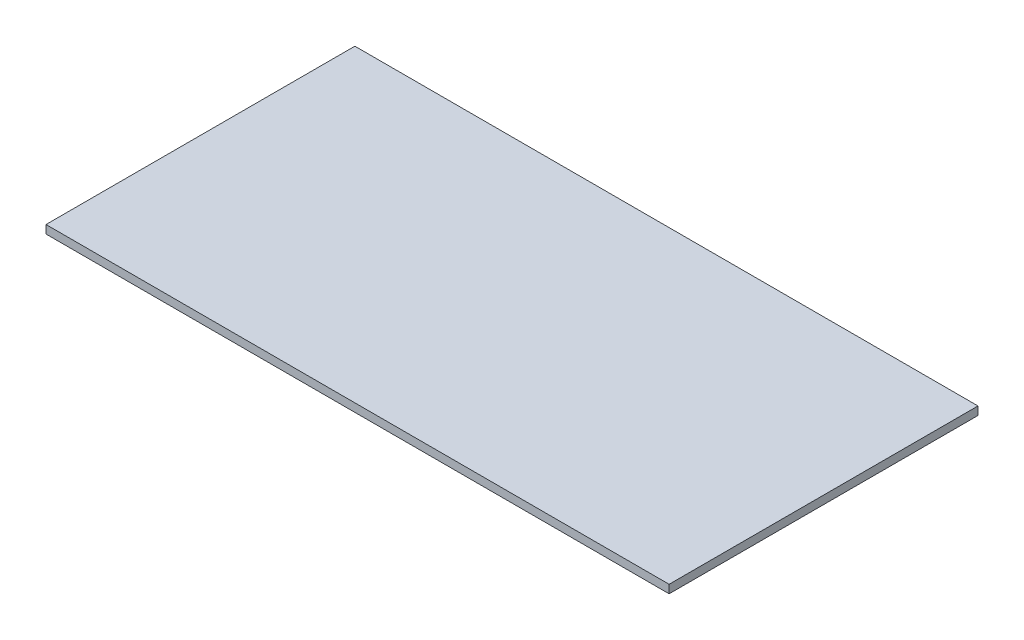
ISO-10303-21;
HEADER;
FILE_DESCRIPTION(('STEP AP214'),'2;1');
FILE_NAME('part.step','',(''),(''),'','','');
FILE_SCHEMA(('AUTOMOTIVE_DESIGN { 1 0 10303 214 1 1 1 1 }'));
ENDSEC;
DATA;
#1=APPLICATION_CONTEXT('core data for automotive mechanical design processes');
#2=APPLICATION_PROTOCOL_DEFINITION('international standard','automotive_design',2000,#1);
#3=PRODUCT_CONTEXT('',#1,'mechanical');
#4=PRODUCT('Part','Part','',(#3));
#5=PRODUCT_RELATED_PRODUCT_CATEGORY('part','',(#4));
#6=PRODUCT_DEFINITION_FORMATION('','',#4);
#7=PRODUCT_DEFINITION_CONTEXT('part definition',#1,'design');
#8=PRODUCT_DEFINITION('design','',#6,#7);
#9=PRODUCT_DEFINITION_SHAPE('','',#8);
#10=(LENGTH_UNIT() NAMED_UNIT(*) SI_UNIT(.MILLI.,.METRE.));
#11=(NAMED_UNIT(*) PLANE_ANGLE_UNIT() SI_UNIT($,.RADIAN.));
#12=(NAMED_UNIT(*) SI_UNIT($,.STERADIAN.) SOLID_ANGLE_UNIT());
#13=UNCERTAINTY_MEASURE_WITH_UNIT(LENGTH_MEASURE(1.E-05),#10,'distance_accuracy_value','');
#14=(GEOMETRIC_REPRESENTATION_CONTEXT(3) GLOBAL_UNCERTAINTY_ASSIGNED_CONTEXT((#13)) GLOBAL_UNIT_ASSIGNED_CONTEXT((#10,
#11,#12)) REPRESENTATION_CONTEXT('',''));
#15=CARTESIAN_POINT('',(0.,0.,0.));
#16=DIRECTION('',(0.,0.,1.));
#17=DIRECTION('',(1.,0.,0.));
#18=AXIS2_PLACEMENT_3D('',#15,#16,#17);
#19=CARTESIAN_POINT('',(75.35,2.,-37.35));
#20=DIRECTION('',(-1.,0.,0.));
#21=DIRECTION('',(0.,0.,1.));
#22=AXIS2_PLACEMENT_3D('',#19,#20,#21);
#23=PLANE('',#22);
#24=DIRECTION('',(0.,0.,-1.));
#25=VECTOR('',#24,1.);
#26=CARTESIAN_POINT('',(75.35,0.,-37.35));
#27=LINE('',#26,#25);
#28=CARTESIAN_POINT('',(75.35,0.,37.35));
#29=VERTEX_POINT('',#28);
#30=CARTESIAN_POINT('',(75.35,0.,-37.35));
#31=VERTEX_POINT('',#30);
#32=EDGE_CURVE('E96',#29,#31,#27,.T.);
#33=ORIENTED_EDGE('',*,*,#32,.T.);
#34=DIRECTION('',(0.,-1.,0.));
#35=VECTOR('',#34,1.);
#36=CARTESIAN_POINT('',(75.35,2.,-37.35));
#37=LINE('',#36,#35);
#38=CARTESIAN_POINT('',(75.35,2.,-37.35));
#39=VERTEX_POINT('',#38);
#40=EDGE_CURVE('E11',#39,#31,#37,.T.);
#41=ORIENTED_EDGE('',*,*,#40,.F.);
#42=DIRECTION('',(0.,0.,-1.));
#43=VECTOR('',#42,1.);
#44=CARTESIAN_POINT('',(75.35,2.,-37.35));
#45=LINE('',#44,#43);
#46=CARTESIAN_POINT('',(75.35,2.,37.35));
#47=VERTEX_POINT('',#46);
#48=EDGE_CURVE('E84',#47,#39,#45,.T.);
#49=ORIENTED_EDGE('',*,*,#48,.F.);
#50=DIRECTION('',(0.,-1.,0.));
#51=VECTOR('',#50,1.);
#52=CARTESIAN_POINT('',(75.35,2.,37.35));
#53=LINE('',#52,#51);
#54=EDGE_CURVE('E92',#47,#29,#53,.T.);
#55=ORIENTED_EDGE('',*,*,#54,.T.);
#56=EDGE_LOOP('',(#33,#41,#49,#55));
#57=FACE_BOUND('',#56,.T.);
#58=ADVANCED_FACE('F33',(#57),#23,.F.);
#59=CARTESIAN_POINT('',(-75.35,2.,-37.35));
#60=DIRECTION('',(0.,0.,1.));
#61=DIRECTION('',(1.,0.,0.));
#62=AXIS2_PLACEMENT_3D('',#59,#60,#61);
#63=PLANE('',#62);
#64=DIRECTION('',(-1.,0.,0.));
#65=VECTOR('',#64,1.);
#66=CARTESIAN_POINT('',(-75.35,0.,-37.35));
#67=LINE('',#66,#65);
#68=CARTESIAN_POINT('',(-75.35,0.,-37.35));
#69=VERTEX_POINT('',#68);
#70=EDGE_CURVE('E88',#31,#69,#67,.T.);
#71=ORIENTED_EDGE('',*,*,#70,.T.);
#72=DIRECTION('',(0.,-1.,0.));
#73=VECTOR('',#72,1.);
#74=CARTESIAN_POINT('',(-75.35,2.,-37.35));
#75=LINE('',#74,#73);
#76=CARTESIAN_POINT('',(-75.35,2.,-37.35));
#77=VERTEX_POINT('',#76);
#78=EDGE_CURVE('E41',#77,#69,#75,.T.);
#79=ORIENTED_EDGE('',*,*,#78,.F.);
#80=DIRECTION('',(-1.,0.,0.));
#81=VECTOR('',#80,1.);
#82=CARTESIAN_POINT('',(-75.35,2.,-37.35));
#83=LINE('',#82,#81);
#84=EDGE_CURVE('E79',#39,#77,#83,.T.);
#85=ORIENTED_EDGE('',*,*,#84,.F.);
#86=ORIENTED_EDGE('',*,*,#40,.T.);
#87=EDGE_LOOP('',(#71,#79,#85,#86));
#88=FACE_BOUND('',#87,.T.);
#89=ADVANCED_FACE('F87',(#88),#63,.F.);
#90=CARTESIAN_POINT('',(-75.35,2.,-37.35));
#91=DIRECTION('',(1.,0.,0.));
#92=DIRECTION('',(0.,0.,-1.));
#93=AXIS2_PLACEMENT_3D('',#90,#91,#92);
#94=PLANE('',#93);
#95=DIRECTION('',(0.,0.,1.));
#96=VECTOR('',#95,1.);
#97=CARTESIAN_POINT('',(-75.35,0.,-37.35));
#98=LINE('',#97,#96);
#99=CARTESIAN_POINT('',(-75.35,0.,37.35));
#100=VERTEX_POINT('',#99);
#101=EDGE_CURVE('E66',#69,#100,#98,.T.);
#102=ORIENTED_EDGE('',*,*,#101,.T.);
#103=DIRECTION('',(0.,-1.,0.));
#104=VECTOR('',#103,1.);
#105=CARTESIAN_POINT('',(-75.35,2.,37.35));
#106=LINE('',#105,#104);
#107=CARTESIAN_POINT('',(-75.35,2.,37.35));
#108=VERTEX_POINT('',#107);
#109=EDGE_CURVE('E89',#108,#100,#106,.T.);
#110=ORIENTED_EDGE('',*,*,#109,.F.);
#111=DIRECTION('',(0.,0.,1.));
#112=VECTOR('',#111,1.);
#113=CARTESIAN_POINT('',(-75.35,2.,-37.35));
#114=LINE('',#113,#112);
#115=EDGE_CURVE('E82',#77,#108,#114,.T.);
#116=ORIENTED_EDGE('',*,*,#115,.F.);
#117=ORIENTED_EDGE('',*,*,#78,.T.);
#118=EDGE_LOOP('',(#102,#110,#116,#117));
#119=FACE_BOUND('',#118,.T.);
#120=ADVANCED_FACE('F90',(#119),#94,.F.);
#121=CARTESIAN_POINT('',(-75.35,2.,37.35));
#122=DIRECTION('',(0.,0.,-1.));
#123=DIRECTION('',(-1.,0.,0.));
#124=AXIS2_PLACEMENT_3D('',#121,#122,#123);
#125=PLANE('',#124);
#126=DIRECTION('',(1.,0.,0.));
#127=VECTOR('',#126,1.);
#128=CARTESIAN_POINT('',(-75.35,0.,37.35));
#129=LINE('',#128,#127);
#130=EDGE_CURVE('E72',#100,#29,#129,.T.);
#131=ORIENTED_EDGE('',*,*,#130,.T.);
#132=ORIENTED_EDGE('',*,*,#54,.F.);
#133=DIRECTION('',(1.,0.,0.));
#134=VECTOR('',#133,1.);
#135=CARTESIAN_POINT('',(-75.35,2.,37.35));
#136=LINE('',#135,#134);
#137=EDGE_CURVE('E49',#108,#47,#136,.T.);
#138=ORIENTED_EDGE('',*,*,#137,.F.);
#139=ORIENTED_EDGE('',*,*,#109,.T.);
#140=EDGE_LOOP('',(#131,#132,#138,#139));
#141=FACE_BOUND('',#140,.T.);
#142=ADVANCED_FACE('F103',(#141),#125,.F.);
#143=CARTESIAN_POINT('',(0.,2.,0.));
#144=DIRECTION('',(0.,1.,0.));
#145=DIRECTION('',(0.,0.,1.));
#146=AXIS2_PLACEMENT_3D('',#143,#144,#145);
#147=PLANE('',#146);
#148=ORIENTED_EDGE('',*,*,#48,.T.);
#149=ORIENTED_EDGE('',*,*,#84,.T.);
#150=ORIENTED_EDGE('',*,*,#115,.T.);
#151=ORIENTED_EDGE('',*,*,#137,.T.);
#152=EDGE_LOOP('',(#148,#149,#150,#151));
#153=FACE_BOUND('',#152,.T.);
#154=ADVANCED_FACE('F80',(#153),#147,.T.);
#155=CARTESIAN_POINT('',(0.,0.,0.));
#156=DIRECTION('',(0.,1.,0.));
#157=DIRECTION('',(0.,0.,1.));
#158=AXIS2_PLACEMENT_3D('',#155,#156,#157);
#159=PLANE('',#158);
#160=ORIENTED_EDGE('',*,*,#32,.F.);
#161=ORIENTED_EDGE('',*,*,#130,.F.);
#162=ORIENTED_EDGE('',*,*,#101,.F.);
#163=ORIENTED_EDGE('',*,*,#70,.F.);
#164=EDGE_LOOP('',(#160,#161,#162,#163));
#165=FACE_BOUND('',#164,.T.);
#166=ADVANCED_FACE('F106',(#165),#159,.F.);
#167=CLOSED_SHELL('',(#58,#89,#120,#142,#154,#166));
#168=MANIFOLD_SOLID_BREP('B2',#167);
#169=ADVANCED_BREP_SHAPE_REPRESENTATION('',(#18,#168),#14);
#170=SHAPE_DEFINITION_REPRESENTATION(#9,#169);
ENDSEC;
END-ISO-10303-21;
